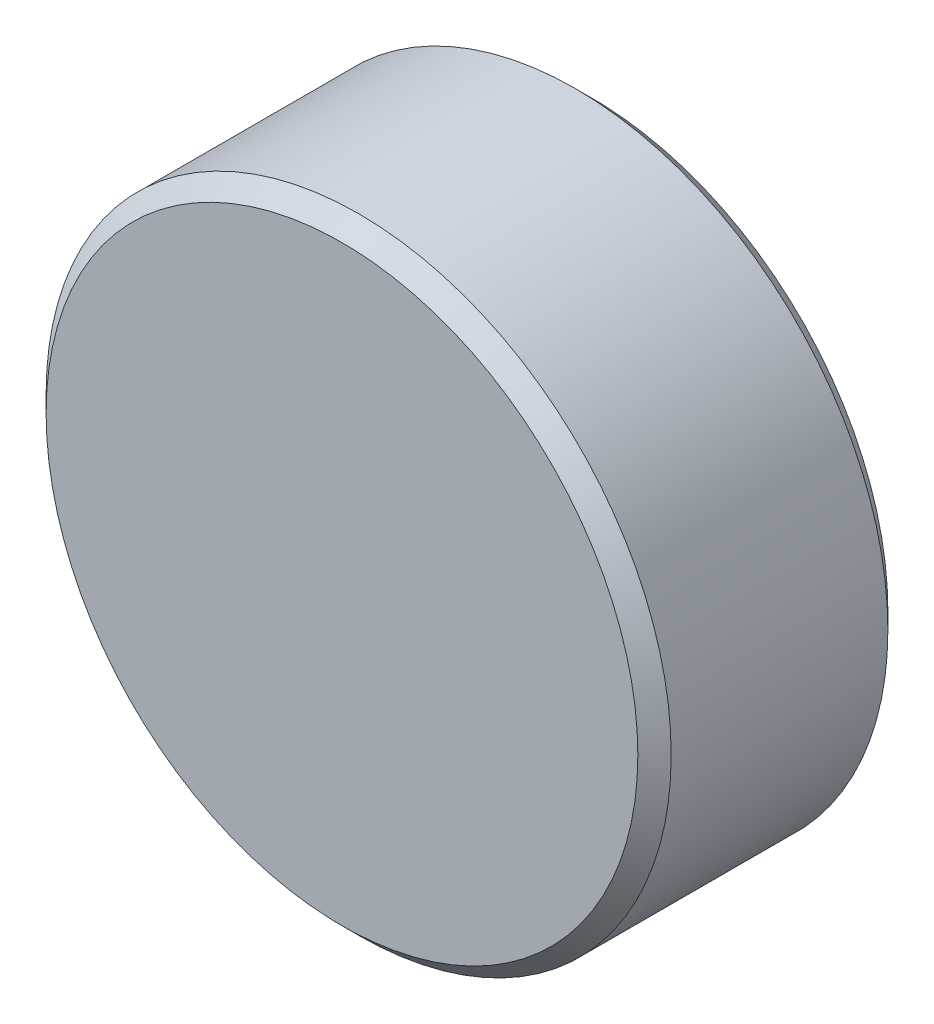
ISO-10303-21;
HEADER;
FILE_DESCRIPTION(('STEP AP214'),'2;1');
FILE_NAME('part.step','',(''),(''),'','','');
FILE_SCHEMA(('AUTOMOTIVE_DESIGN { 1 0 10303 214 1 1 1 1 }'));
ENDSEC;
DATA;
#1=APPLICATION_CONTEXT('core data for automotive mechanical design processes');
#2=APPLICATION_PROTOCOL_DEFINITION('international standard','automotive_design',2000,#1);
#3=PRODUCT_CONTEXT('',#1,'mechanical');
#4=PRODUCT('Part','Part','',(#3));
#5=PRODUCT_RELATED_PRODUCT_CATEGORY('part','',(#4));
#6=PRODUCT_DEFINITION_FORMATION('','',#4);
#7=PRODUCT_DEFINITION_CONTEXT('part definition',#1,'design');
#8=PRODUCT_DEFINITION('design','',#6,#7);
#9=PRODUCT_DEFINITION_SHAPE('','',#8);
#10=(LENGTH_UNIT() NAMED_UNIT(*) SI_UNIT(.MILLI.,.METRE.));
#11=(NAMED_UNIT(*) PLANE_ANGLE_UNIT() SI_UNIT($,.RADIAN.));
#12=(NAMED_UNIT(*) SI_UNIT($,.STERADIAN.) SOLID_ANGLE_UNIT());
#13=UNCERTAINTY_MEASURE_WITH_UNIT(LENGTH_MEASURE(1.E-05),#10,'distance_accuracy_value','');
#14=(GEOMETRIC_REPRESENTATION_CONTEXT(3) GLOBAL_UNCERTAINTY_ASSIGNED_CONTEXT((#13)) GLOBAL_UNIT_ASSIGNED_CONTEXT((#10,
#11,#12)) REPRESENTATION_CONTEXT('',''));
#15=CARTESIAN_POINT('',(0.,0.,0.));
#16=DIRECTION('',(0.,0.,1.));
#17=DIRECTION('',(1.,0.,0.));
#18=AXIS2_PLACEMENT_3D('',#15,#16,#17);
#19=CARTESIAN_POINT('',(0.,0.,30.));
#20=DIRECTION('',(0.,0.,-1.));
#21=DIRECTION('',(-1.,0.,0.));
#22=AXIS2_PLACEMENT_3D('',#19,#20,#21);
#23=CYLINDRICAL_SURFACE('',#22,37.5);
#24=CARTESIAN_POINT('',(0.,0.,28.));
#25=DIRECTION('',(0.,0.,1.));
#26=DIRECTION('',(1.,0.,0.));
#27=AXIS2_PLACEMENT_3D('',#24,#25,#26);
#28=CIRCLE('',#27,37.5);
#29=CARTESIAN_POINT('',(37.5,0.,28.));
#30=VERTEX_POINT('',#29);
#31=EDGE_CURVE('E48',#30,#30,#28,.F.);
#32=ORIENTED_EDGE('',*,*,#31,.T.);
#33=EDGE_LOOP('',(#32));
#34=FACE_BOUND('',#33,.T.);
#35=CARTESIAN_POINT('',(0.,0.,2.00000000000001));
#36=DIRECTION('',(0.,0.,1.));
#37=DIRECTION('',(1.,0.,0.));
#38=AXIS2_PLACEMENT_3D('',#35,#36,#37);
#39=CIRCLE('',#38,37.5);
#40=CARTESIAN_POINT('',(37.5,0.,2.00000000000001));
#41=VERTEX_POINT('',#40);
#42=EDGE_CURVE('E53',#41,#41,#39,.T.);
#43=ORIENTED_EDGE('',*,*,#42,.T.);
#44=EDGE_LOOP('',(#43));
#45=FACE_BOUND('',#44,.T.);
#46=ADVANCED_FACE('F39',(#34,#45),#23,.T.);
#47=CARTESIAN_POINT('',(0.,0.,30.));
#48=DIRECTION('',(0.,0.,1.));
#49=DIRECTION('',(1.,0.,0.));
#50=AXIS2_PLACEMENT_3D('',#47,#48,#49);
#51=PLANE('',#50);
#52=CARTESIAN_POINT('',(0.,0.,30.));
#53=DIRECTION('',(0.,0.,1.));
#54=DIRECTION('',(1.,0.,0.));
#55=AXIS2_PLACEMENT_3D('',#52,#53,#54);
#56=CIRCLE('',#55,35.5);
#57=CARTESIAN_POINT('',(35.5,0.,30.));
#58=VERTEX_POINT('',#57);
#59=EDGE_CURVE('E58',#58,#58,#56,.T.);
#60=ORIENTED_EDGE('',*,*,#59,.T.);
#61=EDGE_LOOP('',(#60));
#62=FACE_BOUND('',#61,.T.);
#63=ADVANCED_FACE('F65',(#62),#51,.T.);
#64=CARTESIAN_POINT('',(0.,0.,0.));
#65=DIRECTION('',(0.,0.,1.));
#66=DIRECTION('',(1.,0.,0.));
#67=AXIS2_PLACEMENT_3D('',#64,#65,#66);
#68=PLANE('',#67);
#69=CARTESIAN_POINT('',(0.,0.,0.));
#70=DIRECTION('',(0.,0.,1.));
#71=DIRECTION('',(1.,0.,0.));
#72=AXIS2_PLACEMENT_3D('',#69,#70,#71);
#73=CIRCLE('',#72,35.5);
#74=CARTESIAN_POINT('',(35.5,0.,0.));
#75=VERTEX_POINT('',#74);
#76=EDGE_CURVE('E10',#75,#75,#73,.F.);
#77=ORIENTED_EDGE('',*,*,#76,.T.);
#78=EDGE_LOOP('',(#77));
#79=FACE_BOUND('',#78,.T.);
#80=ADVANCED_FACE('F69',(#79),#68,.F.);
#81=CARTESIAN_POINT('',(0.,0.,30.));
#82=DIRECTION('',(0.,0.,-1.));
#83=DIRECTION('',(-1.,0.,0.));
#84=AXIS2_PLACEMENT_3D('',#81,#82,#83);
#85=CONICAL_SURFACE('',#84,35.5,0.785398163397447);
#86=ORIENTED_EDGE('',*,*,#31,.F.);
#87=EDGE_LOOP('',(#86));
#88=FACE_BOUND('',#87,.T.);
#89=ORIENTED_EDGE('',*,*,#59,.F.);
#90=EDGE_LOOP('',(#89));
#91=FACE_BOUND('',#90,.T.);
#92=ADVANCED_FACE('F67',(#88,#91),#85,.T.);
#93=CARTESIAN_POINT('',(0.,0.,2.00000000000001));
#94=DIRECTION('',(0.,0.,1.));
#95=DIRECTION('',(1.,0.,0.));
#96=AXIS2_PLACEMENT_3D('',#93,#94,#95);
#97=CONICAL_SURFACE('',#96,37.5,0.785398163397448);
#98=ORIENTED_EDGE('',*,*,#76,.F.);
#99=EDGE_LOOP('',(#98));
#100=FACE_BOUND('',#99,.T.);
#101=ORIENTED_EDGE('',*,*,#42,.F.);
#102=EDGE_LOOP('',(#101));
#103=FACE_BOUND('',#102,.T.);
#104=ADVANCED_FACE('F42',(#100,#103),#97,.T.);
#105=CLOSED_SHELL('',(#46,#63,#80,#92,#104));
#106=MANIFOLD_SOLID_BREP('B2',#105);
#107=ADVANCED_BREP_SHAPE_REPRESENTATION('',(#18,#106),#14);
#108=SHAPE_DEFINITION_REPRESENTATION(#9,#107);
ENDSEC;
END-ISO-10303-21;
